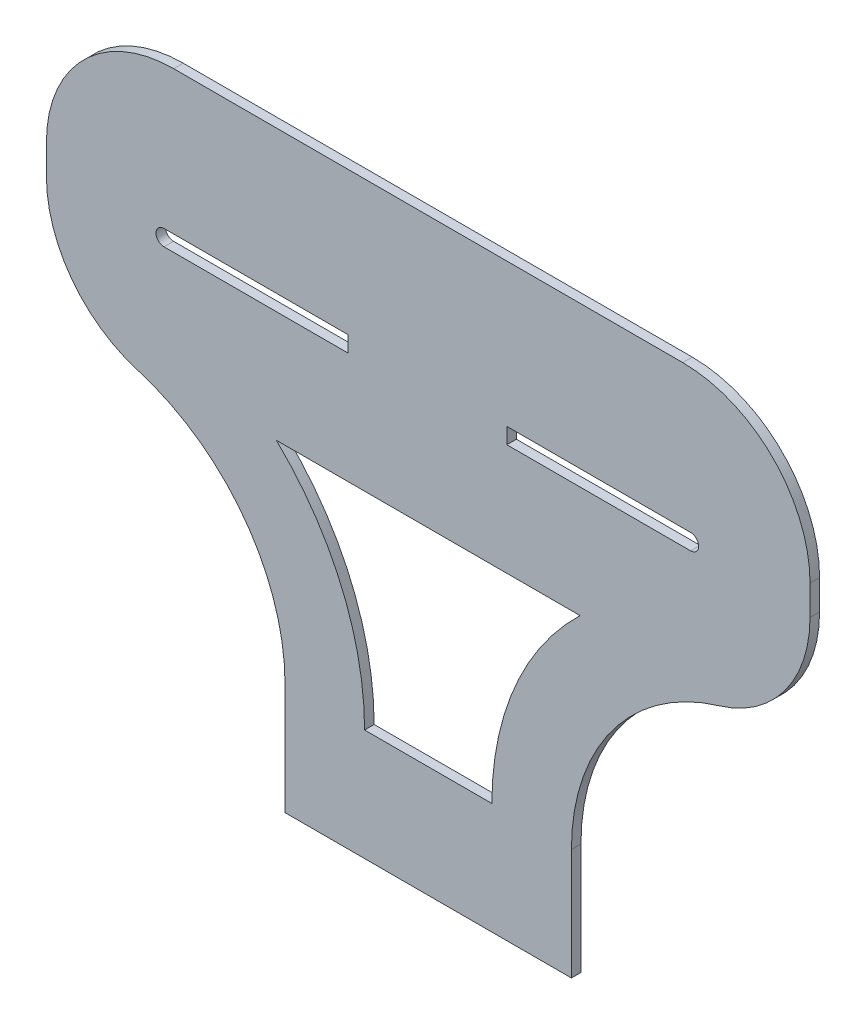
ISO-10303-21;
HEADER;
FILE_DESCRIPTION(('STEP AP214'),'2;1');
FILE_NAME('part.step','',(''),(''),'','','');
FILE_SCHEMA(('AUTOMOTIVE_DESIGN { 1 0 10303 214 1 1 1 1 }'));
ENDSEC;
DATA;
#1=APPLICATION_CONTEXT('core data for automotive mechanical design processes');
#2=APPLICATION_PROTOCOL_DEFINITION('international standard','automotive_design',2000,#1);
#3=PRODUCT_CONTEXT('',#1,'mechanical');
#4=PRODUCT('Part','Part','',(#3));
#5=PRODUCT_RELATED_PRODUCT_CATEGORY('part','',(#4));
#6=PRODUCT_DEFINITION_FORMATION('','',#4);
#7=PRODUCT_DEFINITION_CONTEXT('part definition',#1,'design');
#8=PRODUCT_DEFINITION('design','',#6,#7);
#9=PRODUCT_DEFINITION_SHAPE('','',#8);
#10=(LENGTH_UNIT() NAMED_UNIT(*) SI_UNIT(.MILLI.,.METRE.));
#11=(NAMED_UNIT(*) PLANE_ANGLE_UNIT() SI_UNIT($,.RADIAN.));
#12=(NAMED_UNIT(*) SI_UNIT($,.STERADIAN.) SOLID_ANGLE_UNIT());
#13=UNCERTAINTY_MEASURE_WITH_UNIT(LENGTH_MEASURE(1.E-05),#10,'distance_accuracy_value','');
#14=(GEOMETRIC_REPRESENTATION_CONTEXT(3) GLOBAL_UNCERTAINTY_ASSIGNED_CONTEXT((#13)) GLOBAL_UNIT_ASSIGNED_CONTEXT((#10,
#11,#12)) REPRESENTATION_CONTEXT('',''));
#15=CARTESIAN_POINT('',(0.,0.,0.));
#16=DIRECTION('',(0.,0.,1.));
#17=DIRECTION('',(1.,0.,0.));
#18=AXIS2_PLACEMENT_3D('',#15,#16,#17);
#19=CARTESIAN_POINT('',(254.97396933685,270.,0.));
#20=DIRECTION('',(0.,-1.,0.));
#21=DIRECTION('',(0.,0.,-1.));
#22=AXIS2_PLACEMENT_3D('',#19,#20,#21);
#23=PLANE('',#22);
#24=DIRECTION('',(0.,0.,1.));
#25=VECTOR('',#24,1.);
#26=CARTESIAN_POINT('',(139.426888361613,270.,0.));
#27=LINE('',#26,#25);
#28=CARTESIAN_POINT('',(139.426888361613,270.,0.));
#29=VERTEX_POINT('',#28);
#30=CARTESIAN_POINT('',(139.426888361613,270.,6.));
#31=VERTEX_POINT('',#30);
#32=EDGE_CURVE('E236',#29,#31,#27,.T.);
#33=ORIENTED_EDGE('',*,*,#32,.T.);
#34=DIRECTION('',(1.,0.,0.));
#35=VECTOR('',#34,1.);
#36=CARTESIAN_POINT('',(254.97396933685,270.,6.));
#37=LINE('',#36,#35);
#38=CARTESIAN_POINT('',(254.97396933685,270.,6.));
#39=VERTEX_POINT('',#38);
#40=EDGE_CURVE('E285',#31,#39,#37,.T.);
#41=ORIENTED_EDGE('',*,*,#40,.T.);
#42=DIRECTION('',(0.,0.,1.));
#43=VECTOR('',#42,1.);
#44=CARTESIAN_POINT('',(254.97396933685,270.,0.));
#45=LINE('',#44,#43);
#46=CARTESIAN_POINT('',(254.97396933685,270.,0.));
#47=VERTEX_POINT('',#46);
#48=EDGE_CURVE('E287',#47,#39,#45,.T.);
#49=ORIENTED_EDGE('',*,*,#48,.F.);
#50=DIRECTION('',(1.,0.,0.));
#51=VECTOR('',#50,1.);
#52=CARTESIAN_POINT('',(254.97396933685,270.,0.));
#53=LINE('',#52,#51);
#54=EDGE_CURVE('E52',#29,#47,#53,.T.);
#55=ORIENTED_EDGE('',*,*,#54,.F.);
#56=EDGE_LOOP('',(#33,#41,#49,#55));
#57=FACE_BOUND('',#56,.T.);
#58=ADVANCED_FACE('F37',(#57),#23,.F.);
#59=CARTESIAN_POINT('',(254.97396933685,280.,0.));
#60=DIRECTION('',(0.,1.,0.));
#61=DIRECTION('',(0.,0.,1.));
#62=AXIS2_PLACEMENT_3D('',#59,#60,#61);
#63=PLANE('',#62);
#64=DIRECTION('',(0.,0.,1.));
#65=VECTOR('',#64,1.);
#66=CARTESIAN_POINT('',(139.426888361613,280.,0.));
#67=LINE('',#66,#65);
#68=CARTESIAN_POINT('',(139.426888361613,280.,0.));
#69=VERTEX_POINT('',#68);
#70=CARTESIAN_POINT('',(139.426888361613,280.,6.));
#71=VERTEX_POINT('',#70);
#72=EDGE_CURVE('E232',#69,#71,#67,.T.);
#73=ORIENTED_EDGE('',*,*,#72,.F.);
#74=DIRECTION('',(-1.,0.,0.));
#75=VECTOR('',#74,1.);
#76=CARTESIAN_POINT('',(254.97396933685,280.,0.));
#77=LINE('',#76,#75);
#78=CARTESIAN_POINT('',(254.97396933685,280.,0.));
#79=VERTEX_POINT('',#78);
#80=EDGE_CURVE('E274',#79,#69,#77,.T.);
#81=ORIENTED_EDGE('',*,*,#80,.F.);
#82=DIRECTION('',(0.,0.,1.));
#83=VECTOR('',#82,1.);
#84=CARTESIAN_POINT('',(254.97396933685,280.,0.));
#85=LINE('',#84,#83);
#86=CARTESIAN_POINT('',(254.97396933685,280.,6.));
#87=VERTEX_POINT('',#86);
#88=EDGE_CURVE('E282',#79,#87,#85,.T.);
#89=ORIENTED_EDGE('',*,*,#88,.T.);
#90=DIRECTION('',(-1.,0.,0.));
#91=VECTOR('',#90,1.);
#92=CARTESIAN_POINT('',(254.97396933685,280.,6.));
#93=LINE('',#92,#91);
#94=EDGE_CURVE('E211',#87,#71,#93,.T.);
#95=ORIENTED_EDGE('',*,*,#94,.T.);
#96=EDGE_LOOP('',(#73,#81,#89,#95));
#97=FACE_BOUND('',#96,.T.);
#98=ADVANCED_FACE('F446',(#97),#63,.F.);
#99=CARTESIAN_POINT('',(-150.,0.,6.));
#100=DIRECTION('',(-1.,0.,0.));
#101=DIRECTION('',(0.,0.,1.));
#102=AXIS2_PLACEMENT_3D('',#99,#100,#101);
#103=PLANE('',#102);
#104=DIRECTION('',(0.,1.,0.));
#105=VECTOR('',#104,1.);
#106=CARTESIAN_POINT('',(-150.,0.,0.));
#107=LINE('',#106,#105);
#108=CARTESIAN_POINT('',(-150.,271.290245353056,0.));
#109=VERTEX_POINT('',#108);
#110=CARTESIAN_POINT('',(-150.,290.,0.));
#111=VERTEX_POINT('',#110);
#112=EDGE_CURVE('E304',#109,#111,#107,.T.);
#113=ORIENTED_EDGE('',*,*,#112,.F.);
#114=DIRECTION('',(0.,0.,-1.));
#115=VECTOR('',#114,1.);
#116=CARTESIAN_POINT('',(-150.,271.290245353056,6.));
#117=LINE('',#116,#115);
#118=CARTESIAN_POINT('',(-150.,271.290245353056,6.));
#119=VERTEX_POINT('',#118);
#120=EDGE_CURVE('E45',#109,#119,#117,.F.);
#121=ORIENTED_EDGE('',*,*,#120,.T.);
#122=DIRECTION('',(0.,1.,0.));
#123=VECTOR('',#122,1.);
#124=CARTESIAN_POINT('',(-150.,0.,6.));
#125=LINE('',#124,#123);
#126=CARTESIAN_POINT('',(-150.,290.,6.));
#127=VERTEX_POINT('',#126);
#128=EDGE_CURVE('E307',#119,#127,#125,.T.);
#129=ORIENTED_EDGE('',*,*,#128,.T.);
#130=DIRECTION('',(0.,0.,-1.));
#131=VECTOR('',#130,1.);
#132=CARTESIAN_POINT('',(-150.,290.,6.));
#133=LINE('',#132,#131);
#134=EDGE_CURVE('E365',#127,#111,#133,.T.);
#135=ORIENTED_EDGE('',*,*,#134,.T.);
#136=EDGE_LOOP('',(#113,#121,#129,#135));
#137=FACE_BOUND('',#136,.T.);
#138=ADVANCED_FACE('F385',(#137),#103,.T.);
#139=CARTESIAN_POINT('',(0.,0.,6.));
#140=DIRECTION('',(-1.,0.,0.));
#141=DIRECTION('',(0.,0.,1.));
#142=AXIS2_PLACEMENT_3D('',#139,#140,#141);
#143=PLANE('',#142);
#144=DIRECTION('',(0.,1.,0.));
#145=VECTOR('',#144,1.);
#146=CARTESIAN_POINT('',(0.,0.,0.));
#147=LINE('',#146,#145);
#148=CARTESIAN_POINT('',(0.,0.,0.));
#149=VERTEX_POINT('',#148);
#150=CARTESIAN_POINT('',(0.,70.0000000000001,0.));
#151=VERTEX_POINT('',#150);
#152=EDGE_CURVE('E326',#149,#151,#147,.T.);
#153=ORIENTED_EDGE('',*,*,#152,.F.);
#154=DIRECTION('',(0.,0.,-1.));
#155=VECTOR('',#154,1.);
#156=CARTESIAN_POINT('',(0.,0.,6.));
#157=LINE('',#156,#155);
#158=CARTESIAN_POINT('',(0.,0.,6.));
#159=VERTEX_POINT('',#158);
#160=EDGE_CURVE('E344',#159,#149,#157,.T.);
#161=ORIENTED_EDGE('',*,*,#160,.F.);
#162=DIRECTION('',(0.,1.,0.));
#163=VECTOR('',#162,1.);
#164=CARTESIAN_POINT('',(0.,0.,6.));
#165=LINE('',#164,#163);
#166=CARTESIAN_POINT('',(0.,70.0000000000001,6.));
#167=VERTEX_POINT('',#166);
#168=EDGE_CURVE('E309',#159,#167,#165,.T.);
#169=ORIENTED_EDGE('',*,*,#168,.T.);
#170=DIRECTION('',(0.,0.,-1.));
#171=VECTOR('',#170,1.);
#172=CARTESIAN_POINT('',(0.,70.0000000000001,6.));
#173=LINE('',#172,#171);
#174=EDGE_CURVE('E346',#167,#151,#173,.T.);
#175=ORIENTED_EDGE('',*,*,#174,.T.);
#176=EDGE_LOOP('',(#153,#161,#169,#175));
#177=FACE_BOUND('',#176,.T.);
#178=ADVANCED_FACE('F430',(#177),#143,.T.);
#179=CARTESIAN_POINT('',(0.,0.,6.));
#180=DIRECTION('',(0.,1.,0.));
#181=DIRECTION('',(0.,0.,1.));
#182=AXIS2_PLACEMENT_3D('',#179,#180,#181);
#183=PLANE('',#182);
#184=DIRECTION('',(1.,0.,0.));
#185=VECTOR('',#184,1.);
#186=CARTESIAN_POINT('',(0.,0.,0.));
#187=LINE('',#186,#185);
#188=CARTESIAN_POINT('',(180.,0.,0.));
#189=VERTEX_POINT('',#188);
#190=EDGE_CURVE('E329',#149,#189,#187,.T.);
#191=ORIENTED_EDGE('',*,*,#190,.T.);
#192=DIRECTION('',(0.,0.,-1.));
#193=VECTOR('',#192,1.);
#194=CARTESIAN_POINT('',(180.,0.,6.));
#195=LINE('',#194,#193);
#196=CARTESIAN_POINT('',(180.,0.,6.));
#197=VERTEX_POINT('',#196);
#198=EDGE_CURVE('E341',#197,#189,#195,.T.);
#199=ORIENTED_EDGE('',*,*,#198,.F.);
#200=DIRECTION('',(1.,0.,0.));
#201=VECTOR('',#200,1.);
#202=CARTESIAN_POINT('',(0.,0.,6.));
#203=LINE('',#202,#201);
#204=EDGE_CURVE('E313',#159,#197,#203,.T.);
#205=ORIENTED_EDGE('',*,*,#204,.F.);
#206=ORIENTED_EDGE('',*,*,#160,.T.);
#207=EDGE_LOOP('',(#191,#199,#205,#206));
#208=FACE_BOUND('',#207,.T.);
#209=ADVANCED_FACE('F436',(#208),#183,.F.);
#210=CARTESIAN_POINT('',(180.,0.,6.));
#211=DIRECTION('',(-1.,0.,0.));
#212=DIRECTION('',(0.,0.,1.));
#213=AXIS2_PLACEMENT_3D('',#210,#211,#212);
#214=PLANE('',#213);
#215=DIRECTION('',(0.,1.,0.));
#216=VECTOR('',#215,1.);
#217=CARTESIAN_POINT('',(180.,0.,0.));
#218=LINE('',#217,#216);
#219=CARTESIAN_POINT('',(180.,70.,0.));
#220=VERTEX_POINT('',#219);
#221=EDGE_CURVE('E331',#189,#220,#218,.T.);
#222=ORIENTED_EDGE('',*,*,#221,.T.);
#223=DIRECTION('',(0.,0.,-1.));
#224=VECTOR('',#223,1.);
#225=CARTESIAN_POINT('',(180.,70.,6.));
#226=LINE('',#225,#224);
#227=CARTESIAN_POINT('',(180.,70.,6.));
#228=VERTEX_POINT('',#227);
#229=EDGE_CURVE('E324',#228,#220,#226,.T.);
#230=ORIENTED_EDGE('',*,*,#229,.F.);
#231=DIRECTION('',(0.,1.,0.));
#232=VECTOR('',#231,1.);
#233=CARTESIAN_POINT('',(180.,0.,6.));
#234=LINE('',#233,#232);
#235=EDGE_CURVE('E315',#197,#228,#234,.T.);
#236=ORIENTED_EDGE('',*,*,#235,.F.);
#237=ORIENTED_EDGE('',*,*,#198,.T.);
#238=EDGE_LOOP('',(#222,#230,#236,#237));
#239=FACE_BOUND('',#238,.T.);
#240=ADVANCED_FACE('F424',(#239),#214,.F.);
#241=CARTESIAN_POINT('',(330.,2.15513881250766E-13,6.));
#242=DIRECTION('',(1.,0.,0.));
#243=DIRECTION('',(0.,1.,0.));
#244=AXIS2_PLACEMENT_3D('',#241,#242,#243);
#245=PLANE('',#244);
#246=DIRECTION('',(0.,-1.,0.));
#247=VECTOR('',#246,1.);
#248=CARTESIAN_POINT('',(330.,2.15513881250766E-13,6.));
#249=LINE('',#248,#247);
#250=CARTESIAN_POINT('',(330.,290.,6.));
#251=VERTEX_POINT('',#250);
#252=CARTESIAN_POINT('',(330.,271.290245353056,6.));
#253=VERTEX_POINT('',#252);
#254=EDGE_CURVE('E318',#251,#253,#249,.T.);
#255=ORIENTED_EDGE('',*,*,#254,.T.);
#256=DIRECTION('',(0.,0.,-1.));
#257=VECTOR('',#256,1.);
#258=CARTESIAN_POINT('',(330.,271.290245353056,0.));
#259=LINE('',#258,#257);
#260=CARTESIAN_POINT('',(330.,271.290245353056,0.));
#261=VERTEX_POINT('',#260);
#262=EDGE_CURVE('E375',#253,#261,#259,.T.);
#263=ORIENTED_EDGE('',*,*,#262,.T.);
#264=DIRECTION('',(0.,-1.,0.));
#265=VECTOR('',#264,1.);
#266=CARTESIAN_POINT('',(330.,2.15513881250766E-13,0.));
#267=LINE('',#266,#265);
#268=CARTESIAN_POINT('',(330.,290.,0.));
#269=VERTEX_POINT('',#268);
#270=EDGE_CURVE('E334',#269,#261,#267,.T.);
#271=ORIENTED_EDGE('',*,*,#270,.F.);
#272=DIRECTION('',(0.,0.,-1.));
#273=VECTOR('',#272,1.);
#274=CARTESIAN_POINT('',(330.,290.,6.));
#275=LINE('',#274,#273);
#276=EDGE_CURVE('E358',#269,#251,#275,.F.);
#277=ORIENTED_EDGE('',*,*,#276,.T.);
#278=EDGE_LOOP('',(#255,#263,#271,#277));
#279=FACE_BOUND('',#278,.T.);
#280=ADVANCED_FACE('F411',(#279),#245,.T.);
#281=CARTESIAN_POINT('',(0.,370.,6.));
#282=DIRECTION('',(0.,1.,0.));
#283=DIRECTION('',(0.,0.,1.));
#284=AXIS2_PLACEMENT_3D('',#281,#282,#283);
#285=PLANE('',#284);
#286=DIRECTION('',(1.,0.,0.));
#287=VECTOR('',#286,1.);
#288=CARTESIAN_POINT('',(0.,370.,6.));
#289=LINE('',#288,#287);
#290=CARTESIAN_POINT('',(-70.,370.,6.));
#291=VERTEX_POINT('',#290);
#292=CARTESIAN_POINT('',(250.,370.,6.));
#293=VERTEX_POINT('',#292);
#294=EDGE_CURVE('E321',#291,#293,#289,.T.);
#295=ORIENTED_EDGE('',*,*,#294,.T.);
#296=DIRECTION('',(0.,0.,-1.));
#297=VECTOR('',#296,1.);
#298=CARTESIAN_POINT('',(250.,370.,6.));
#299=LINE('',#298,#297);
#300=CARTESIAN_POINT('',(250.,370.,0.));
#301=VERTEX_POINT('',#300);
#302=EDGE_CURVE('E351',#293,#301,#299,.T.);
#303=ORIENTED_EDGE('',*,*,#302,.T.);
#304=DIRECTION('',(1.,0.,0.));
#305=VECTOR('',#304,1.);
#306=CARTESIAN_POINT('',(0.,370.,0.));
#307=LINE('',#306,#305);
#308=CARTESIAN_POINT('',(-70.,370.,0.));
#309=VERTEX_POINT('',#308);
#310=EDGE_CURVE('E310',#309,#301,#307,.T.);
#311=ORIENTED_EDGE('',*,*,#310,.F.);
#312=DIRECTION('',(0.,0.,-1.));
#313=VECTOR('',#312,1.);
#314=CARTESIAN_POINT('',(-70.,370.,6.));
#315=LINE('',#314,#313);
#316=EDGE_CURVE('E349',#309,#291,#315,.F.);
#317=ORIENTED_EDGE('',*,*,#316,.T.);
#318=EDGE_LOOP('',(#295,#303,#311,#317));
#319=FACE_BOUND('',#318,.T.);
#320=ADVANCED_FACE('F402',(#319),#285,.T.);
#321=CARTESIAN_POINT('',(0.,0.,6.));
#322=DIRECTION('',(0.,0.,1.));
#323=DIRECTION('',(1.,0.,0.));
#324=AXIS2_PLACEMENT_3D('',#321,#322,#323);
#325=PLANE('',#324);
#326=DIRECTION('',(0.,-1.,0.));
#327=VECTOR('',#326,1.);
#328=CARTESIAN_POINT('',(39.4268883616133,280.,6.));
#329=LINE('',#328,#327);
#330=CARTESIAN_POINT('',(39.4268883616133,280.,6.));
#331=VERTEX_POINT('',#330);
#332=CARTESIAN_POINT('',(39.4268883616133,270.,6.));
#333=VERTEX_POINT('',#332);
#334=EDGE_CURVE('E205',#331,#333,#329,.T.);
#335=ORIENTED_EDGE('',*,*,#334,.T.);
#336=CARTESIAN_POINT('',(-76.1201926136232,270.,6.));
#337=VERTEX_POINT('',#336);
#338=EDGE_CURVE('E273',#337,#333,#37,.T.);
#339=ORIENTED_EDGE('',*,*,#338,.F.);
#340=CARTESIAN_POINT('',(-76.1201926136232,275.,6.));
#341=DIRECTION('',(0.,0.,1.));
#342=DIRECTION('',(1.,0.,0.));
#343=AXIS2_PLACEMENT_3D('',#340,#341,#342);
#344=CIRCLE('',#343,5.);
#345=CARTESIAN_POINT('',(-76.1201926136232,280.,6.));
#346=VERTEX_POINT('',#345);
#347=EDGE_CURVE('E207',#346,#337,#344,.T.);
#348=ORIENTED_EDGE('',*,*,#347,.F.);
#349=EDGE_CURVE('E199',#331,#346,#93,.T.);
#350=ORIENTED_EDGE('',*,*,#349,.F.);
#351=EDGE_LOOP('',(#335,#339,#348,#350));
#352=FACE_BOUND('',#351,.T.);
#353=CARTESIAN_POINT('',(-130.059209580978,70.0000000000001,6.));
#354=DIRECTION('',(0.,0.,-1.));
#355=DIRECTION('',(1.,0.,0.));
#356=AXIS2_PLACEMENT_3D('',#353,#354,#355);
#357=CIRCLE('',#356,180.059209580978);
#358=CARTESIAN_POINT('',(-5.47462403795615,200.,6.));
#359=VERTEX_POINT('',#358);
#360=CARTESIAN_POINT('',(50.,70.0000000000001,6.));
#361=VERTEX_POINT('',#360);
#362=EDGE_CURVE('E235',#359,#361,#357,.T.);
#363=ORIENTED_EDGE('',*,*,#362,.F.);
#364=DIRECTION('',(-1.,0.,0.));
#365=VECTOR('',#364,1.);
#366=CARTESIAN_POINT('',(-5.47462403795615,200.,6.));
#367=LINE('',#366,#365);
#368=CARTESIAN_POINT('',(185.453428356756,200.,6.));
#369=VERTEX_POINT('',#368);
#370=EDGE_CURVE('E243',#369,#359,#367,.T.);
#371=ORIENTED_EDGE('',*,*,#370,.F.);
#372=CARTESIAN_POINT('',(310.059209580978,70.0203160473616,6.));
#373=DIRECTION('',(0.,0.,-1.));
#374=DIRECTION('',(1.,0.,0.));
#375=AXIS2_PLACEMENT_3D('',#372,#373,#374);
#376=CIRCLE('',#375,180.059209580978);
#377=CARTESIAN_POINT('',(130.,70.0203160473617,6.));
#378=VERTEX_POINT('',#377);
#379=EDGE_CURVE('E257',#378,#369,#376,.T.);
#380=ORIENTED_EDGE('',*,*,#379,.F.);
#381=DIRECTION('',(0.99999996775455,0.000253950583831164,0.));
#382=VECTOR('',#381,1.);
#383=CARTESIAN_POINT('',(50.,70.0000000000001,6.));
#384=LINE('',#383,#382);
#385=EDGE_CURVE('E254',#361,#378,#384,.T.);
#386=ORIENTED_EDGE('',*,*,#385,.F.);
#387=EDGE_LOOP('',(#363,#371,#380,#386));
#388=FACE_BOUND('',#387,.T.);
#389=CARTESIAN_POINT('',(254.97396933685,275.,6.));
#390=DIRECTION('',(0.,0.,1.));
#391=DIRECTION('',(1.,0.,0.));
#392=AXIS2_PLACEMENT_3D('',#389,#390,#391);
#393=CIRCLE('',#392,5.);
#394=EDGE_CURVE('E212',#39,#87,#393,.T.);
#395=ORIENTED_EDGE('',*,*,#394,.F.);
#396=ORIENTED_EDGE('',*,*,#40,.F.);
#397=DIRECTION('',(0.,-1.,0.));
#398=VECTOR('',#397,1.);
#399=CARTESIAN_POINT('',(139.426888361613,280.,6.));
#400=LINE('',#399,#398);
#401=EDGE_CURVE('E224',#71,#31,#400,.T.);
#402=ORIENTED_EDGE('',*,*,#401,.F.);
#403=ORIENTED_EDGE('',*,*,#94,.F.);
#404=EDGE_LOOP('',(#395,#396,#402,#403));
#405=FACE_BOUND('',#404,.T.);
#406=CARTESIAN_POINT('',(310.059209580978,70.,6.));
#407=DIRECTION('',(0.,0.,1.));
#408=DIRECTION('',(-1.,0.,0.));
#409=AXIS2_PLACEMENT_3D('',#406,#407,#408);
#410=CIRCLE('',#409,130.059209580978);
#411=CARTESIAN_POINT('',(272.8732497664,194.629861548095,6.));
#412=VERTEX_POINT('',#411);
#413=EDGE_CURVE('E290',#412,#228,#410,.T.);
#414=ORIENTED_EDGE('',*,*,#413,.F.);
#415=CARTESIAN_POINT('',(250.,271.290245353056,6.));
#416=DIRECTION('',(0.,0.,1.));
#417=DIRECTION('',(1.,0.,0.));
#418=AXIS2_PLACEMENT_3D('',#415,#416,#417);
#419=CIRCLE('',#418,80.);
#420=EDGE_CURVE('E373',#412,#253,#419,.T.);
#421=ORIENTED_EDGE('',*,*,#420,.T.);
#422=ORIENTED_EDGE('',*,*,#254,.F.);
#423=CARTESIAN_POINT('',(250.,290.,6.));
#424=DIRECTION('',(0.,0.,1.));
#425=DIRECTION('',(1.,0.,0.));
#426=AXIS2_PLACEMENT_3D('',#423,#424,#425);
#427=CIRCLE('',#426,80.);
#428=EDGE_CURVE('E363',#251,#293,#427,.T.);
#429=ORIENTED_EDGE('',*,*,#428,.T.);
#430=ORIENTED_EDGE('',*,*,#294,.F.);
#431=CARTESIAN_POINT('',(-70.,290.,6.));
#432=DIRECTION('',(0.,0.,1.));
#433=DIRECTION('',(1.,0.,0.));
#434=AXIS2_PLACEMENT_3D('',#431,#432,#433);
#435=CIRCLE('',#434,80.);
#436=EDGE_CURVE('E360',#291,#127,#435,.T.);
#437=ORIENTED_EDGE('',*,*,#436,.T.);
#438=ORIENTED_EDGE('',*,*,#128,.F.);
#439=CARTESIAN_POINT('',(-70.,271.290245353056,6.));
#440=DIRECTION('',(0.,0.,1.));
#441=DIRECTION('',(1.,0.,0.));
#442=AXIS2_PLACEMENT_3D('',#439,#440,#441);
#443=CIRCLE('',#442,80.);
#444=CARTESIAN_POINT('',(-92.8732497663998,194.629861548095,6.));
#445=VERTEX_POINT('',#444);
#446=EDGE_CURVE('E371',#119,#445,#443,.T.);
#447=ORIENTED_EDGE('',*,*,#446,.T.);
#448=CARTESIAN_POINT('',(-130.059209580978,70.0000000000001,6.));
#449=DIRECTION('',(0.,0.,1.));
#450=DIRECTION('',(1.,0.,0.));
#451=AXIS2_PLACEMENT_3D('',#448,#449,#450);
#452=CIRCLE('',#451,130.059209580978);
#453=EDGE_CURVE('E299',#167,#445,#452,.T.);
#454=ORIENTED_EDGE('',*,*,#453,.F.);
#455=ORIENTED_EDGE('',*,*,#168,.F.);
#456=ORIENTED_EDGE('',*,*,#204,.T.);
#457=ORIENTED_EDGE('',*,*,#235,.T.);
#458=EDGE_LOOP('',(#414,#421,#422,#429,#430,#437,#438,#447,#454,#455,#456,#457));
#459=FACE_BOUND('',#458,.T.);
#460=ADVANCED_FACE('F201',(#352,#388,#405,#459),#325,.T.);
#461=CARTESIAN_POINT('',(0.,0.,0.));
#462=DIRECTION('',(0.,0.,1.));
#463=DIRECTION('',(1.,0.,0.));
#464=AXIS2_PLACEMENT_3D('',#461,#462,#463);
#465=PLANE('',#464);
#466=CARTESIAN_POINT('',(-76.1201926136232,270.,0.));
#467=VERTEX_POINT('',#466);
#468=CARTESIAN_POINT('',(39.4268883616133,270.,0.));
#469=VERTEX_POINT('',#468);
#470=EDGE_CURVE('E280',#467,#469,#53,.T.);
#471=ORIENTED_EDGE('',*,*,#470,.T.);
#472=DIRECTION('',(0.,-1.,0.));
#473=VECTOR('',#472,1.);
#474=CARTESIAN_POINT('',(39.4268883616133,280.,0.));
#475=LINE('',#474,#473);
#476=CARTESIAN_POINT('',(39.4268883616133,280.,0.));
#477=VERTEX_POINT('',#476);
#478=EDGE_CURVE('E227',#477,#469,#475,.T.);
#479=ORIENTED_EDGE('',*,*,#478,.F.);
#480=CARTESIAN_POINT('',(-76.1201926136232,280.,0.));
#481=VERTEX_POINT('',#480);
#482=EDGE_CURVE('E217',#477,#481,#77,.T.);
#483=ORIENTED_EDGE('',*,*,#482,.T.);
#484=CARTESIAN_POINT('',(-76.1201926136232,275.,0.));
#485=DIRECTION('',(0.,0.,1.));
#486=DIRECTION('',(1.,0.,0.));
#487=AXIS2_PLACEMENT_3D('',#484,#485,#486);
#488=CIRCLE('',#487,5.);
#489=EDGE_CURVE('E277',#481,#467,#488,.T.);
#490=ORIENTED_EDGE('',*,*,#489,.T.);
#491=EDGE_LOOP('',(#471,#479,#483,#490));
#492=FACE_BOUND('',#491,.T.);
#493=DIRECTION('',(-1.,0.,0.));
#494=VECTOR('',#493,1.);
#495=CARTESIAN_POINT('',(-5.47462403795615,200.,0.));
#496=LINE('',#495,#494);
#497=CARTESIAN_POINT('',(185.453428356756,200.,0.));
#498=VERTEX_POINT('',#497);
#499=CARTESIAN_POINT('',(-5.47462403795615,200.,0.));
#500=VERTEX_POINT('',#499);
#501=EDGE_CURVE('E249',#498,#500,#496,.T.);
#502=ORIENTED_EDGE('',*,*,#501,.T.);
#503=CARTESIAN_POINT('',(-130.059209580978,70.0000000000001,0.));
#504=DIRECTION('',(0.,0.,-1.));
#505=DIRECTION('',(1.,0.,0.));
#506=AXIS2_PLACEMENT_3D('',#503,#504,#505);
#507=CIRCLE('',#506,180.059209580978);
#508=CARTESIAN_POINT('',(50.,70.0000000000001,0.));
#509=VERTEX_POINT('',#508);
#510=EDGE_CURVE('E239',#500,#509,#507,.T.);
#511=ORIENTED_EDGE('',*,*,#510,.T.);
#512=DIRECTION('',(0.99999996775455,0.000253950583831164,0.));
#513=VECTOR('',#512,1.);
#514=CARTESIAN_POINT('',(50.,70.0000000000001,0.));
#515=LINE('',#514,#513);
#516=CARTESIAN_POINT('',(130.,70.0203160473617,0.));
#517=VERTEX_POINT('',#516);
#518=EDGE_CURVE('E242',#509,#517,#515,.T.);
#519=ORIENTED_EDGE('',*,*,#518,.T.);
#520=CARTESIAN_POINT('',(310.059209580978,70.0203160473616,0.));
#521=DIRECTION('',(0.,0.,-1.));
#522=DIRECTION('',(1.,0.,0.));
#523=AXIS2_PLACEMENT_3D('',#520,#521,#522);
#524=CIRCLE('',#523,180.059209580978);
#525=EDGE_CURVE('E246',#517,#498,#524,.T.);
#526=ORIENTED_EDGE('',*,*,#525,.T.);
#527=EDGE_LOOP('',(#502,#511,#519,#526));
#528=FACE_BOUND('',#527,.T.);
#529=DIRECTION('',(0.,-1.,0.));
#530=VECTOR('',#529,1.);
#531=CARTESIAN_POINT('',(139.426888361613,280.,0.));
#532=LINE('',#531,#530);
#533=EDGE_CURVE('E221',#69,#29,#532,.T.);
#534=ORIENTED_EDGE('',*,*,#533,.T.);
#535=ORIENTED_EDGE('',*,*,#54,.T.);
#536=CARTESIAN_POINT('',(254.97396933685,275.,0.));
#537=DIRECTION('',(0.,0.,1.));
#538=DIRECTION('',(1.,0.,0.));
#539=AXIS2_PLACEMENT_3D('',#536,#537,#538);
#540=CIRCLE('',#539,5.);
#541=EDGE_CURVE('E270',#47,#79,#540,.T.);
#542=ORIENTED_EDGE('',*,*,#541,.T.);
#543=ORIENTED_EDGE('',*,*,#80,.T.);
#544=EDGE_LOOP('',(#534,#535,#542,#543));
#545=FACE_BOUND('',#544,.T.);
#546=ORIENTED_EDGE('',*,*,#270,.T.);
#547=CARTESIAN_POINT('',(250.,271.290245353056,0.));
#548=DIRECTION('',(0.,0.,1.));
#549=DIRECTION('',(1.,0.,0.));
#550=AXIS2_PLACEMENT_3D('',#547,#548,#549);
#551=CIRCLE('',#550,80.);
#552=CARTESIAN_POINT('',(272.8732497664,194.629861548095,0.));
#553=VERTEX_POINT('',#552);
#554=EDGE_CURVE('E379',#261,#553,#551,.F.);
#555=ORIENTED_EDGE('',*,*,#554,.T.);
#556=CARTESIAN_POINT('',(310.059209580978,70.,0.));
#557=DIRECTION('',(0.,0.,1.));
#558=DIRECTION('',(-1.,0.,0.));
#559=AXIS2_PLACEMENT_3D('',#556,#557,#558);
#560=CIRCLE('',#559,130.059209580978);
#561=EDGE_CURVE('E297',#553,#220,#560,.T.);
#562=ORIENTED_EDGE('',*,*,#561,.T.);
#563=ORIENTED_EDGE('',*,*,#221,.F.);
#564=ORIENTED_EDGE('',*,*,#190,.F.);
#565=ORIENTED_EDGE('',*,*,#152,.T.);
#566=CARTESIAN_POINT('',(-130.059209580978,70.0000000000001,0.));
#567=DIRECTION('',(0.,0.,1.));
#568=DIRECTION('',(1.,0.,0.));
#569=AXIS2_PLACEMENT_3D('',#566,#567,#568);
#570=CIRCLE('',#569,130.059209580978);
#571=CARTESIAN_POINT('',(-92.8732497663998,194.629861548095,0.));
#572=VERTEX_POINT('',#571);
#573=EDGE_CURVE('E301',#151,#572,#570,.T.);
#574=ORIENTED_EDGE('',*,*,#573,.T.);
#575=CARTESIAN_POINT('',(-70.,271.290245353056,0.));
#576=DIRECTION('',(0.,0.,1.));
#577=DIRECTION('',(1.,0.,0.));
#578=AXIS2_PLACEMENT_3D('',#575,#576,#577);
#579=CIRCLE('',#578,80.);
#580=EDGE_CURVE('E377',#572,#109,#579,.F.);
#581=ORIENTED_EDGE('',*,*,#580,.T.);
#582=ORIENTED_EDGE('',*,*,#112,.T.);
#583=CARTESIAN_POINT('',(-70.,290.,0.));
#584=DIRECTION('',(0.,0.,1.));
#585=DIRECTION('',(1.,0.,0.));
#586=AXIS2_PLACEMENT_3D('',#583,#584,#585);
#587=CIRCLE('',#586,80.);
#588=EDGE_CURVE('E354',#111,#309,#587,.F.);
#589=ORIENTED_EDGE('',*,*,#588,.T.);
#590=ORIENTED_EDGE('',*,*,#310,.T.);
#591=CARTESIAN_POINT('',(250.,290.,0.));
#592=DIRECTION('',(0.,0.,1.));
#593=DIRECTION('',(1.,0.,0.));
#594=AXIS2_PLACEMENT_3D('',#591,#592,#593);
#595=CIRCLE('',#594,80.);
#596=EDGE_CURVE('E356',#301,#269,#595,.F.);
#597=ORIENTED_EDGE('',*,*,#596,.T.);
#598=EDGE_LOOP('',(#546,#555,#562,#563,#564,#565,#574,#581,#582,#589,#590,#597));
#599=FACE_BOUND('',#598,.T.);
#600=ADVANCED_FACE('F400',(#492,#528,#545,#599),#465,.F.);
#601=CARTESIAN_POINT('',(250.,290.,6.));
#602=DIRECTION('',(0.,0.,-1.));
#603=DIRECTION('',(-1.,0.,0.));
#604=AXIS2_PLACEMENT_3D('',#601,#602,#603);
#605=CYLINDRICAL_SURFACE('',#604,80.);
#606=ORIENTED_EDGE('',*,*,#428,.F.);
#607=ORIENTED_EDGE('',*,*,#276,.F.);
#608=ORIENTED_EDGE('',*,*,#596,.F.);
#609=ORIENTED_EDGE('',*,*,#302,.F.);
#610=EDGE_LOOP('',(#606,#607,#608,#609));
#611=FACE_BOUND('',#610,.T.);
#612=ADVANCED_FACE('F406',(#611),#605,.T.);
#613=CARTESIAN_POINT('',(-70.,290.,6.));
#614=DIRECTION('',(0.,0.,-1.));
#615=DIRECTION('',(-1.,0.,0.));
#616=AXIS2_PLACEMENT_3D('',#613,#614,#615);
#617=CYLINDRICAL_SURFACE('',#616,80.);
#618=ORIENTED_EDGE('',*,*,#436,.F.);
#619=ORIENTED_EDGE('',*,*,#316,.F.);
#620=ORIENTED_EDGE('',*,*,#588,.F.);
#621=ORIENTED_EDGE('',*,*,#134,.F.);
#622=EDGE_LOOP('',(#618,#619,#620,#621));
#623=FACE_BOUND('',#622,.T.);
#624=ADVANCED_FACE('F397',(#623),#617,.T.);
#625=CARTESIAN_POINT('',(-130.059209580978,70.0000000000001,0.));
#626=DIRECTION('',(0.,0.,1.));
#627=DIRECTION('',(1.,0.,0.));
#628=AXIS2_PLACEMENT_3D('',#625,#626,#627);
#629=CYLINDRICAL_SURFACE('',#628,130.059209580978);
#630=ORIENTED_EDGE('',*,*,#453,.T.);
#631=DIRECTION('',(0.,0.,1.));
#632=VECTOR('',#631,1.);
#633=CARTESIAN_POINT('',(-92.8732497663998,194.629861548095,0.));
#634=LINE('',#633,#632);
#635=EDGE_CURVE('E11',#445,#572,#634,.F.);
#636=ORIENTED_EDGE('',*,*,#635,.T.);
#637=ORIENTED_EDGE('',*,*,#573,.F.);
#638=ORIENTED_EDGE('',*,*,#174,.F.);
#639=EDGE_LOOP('',(#630,#636,#637,#638));
#640=FACE_BOUND('',#639,.T.);
#641=ADVANCED_FACE('F434',(#640),#629,.F.);
#642=CARTESIAN_POINT('',(310.059209580978,70.,0.));
#643=DIRECTION('',(0.,0.,1.));
#644=DIRECTION('',(1.,0.,0.));
#645=AXIS2_PLACEMENT_3D('',#642,#643,#644);
#646=CYLINDRICAL_SURFACE('',#645,130.059209580978);
#647=ORIENTED_EDGE('',*,*,#561,.F.);
#648=DIRECTION('',(0.,0.,1.));
#649=VECTOR('',#648,1.);
#650=CARTESIAN_POINT('',(272.8732497664,194.629861548095,0.));
#651=LINE('',#650,#649);
#652=EDGE_CURVE('E368',#553,#412,#651,.T.);
#653=ORIENTED_EDGE('',*,*,#652,.T.);
#654=ORIENTED_EDGE('',*,*,#413,.T.);
#655=ORIENTED_EDGE('',*,*,#229,.T.);
#656=EDGE_LOOP('',(#647,#653,#654,#655));
#657=FACE_BOUND('',#656,.T.);
#658=ADVANCED_FACE('F420',(#657),#646,.F.);
#659=CARTESIAN_POINT('',(250.,271.290245353056,0.));
#660=DIRECTION('',(0.,0.,1.));
#661=DIRECTION('',(1.,0.,0.));
#662=AXIS2_PLACEMENT_3D('',#659,#660,#661);
#663=CYLINDRICAL_SURFACE('',#662,80.);
#664=ORIENTED_EDGE('',*,*,#554,.F.);
#665=ORIENTED_EDGE('',*,*,#262,.F.);
#666=ORIENTED_EDGE('',*,*,#420,.F.);
#667=ORIENTED_EDGE('',*,*,#652,.F.);
#668=EDGE_LOOP('',(#664,#665,#666,#667));
#669=FACE_BOUND('',#668,.T.);
#670=ADVANCED_FACE('F415',(#669),#663,.T.);
#671=CARTESIAN_POINT('',(-70.,271.290245353056,0.));
#672=DIRECTION('',(0.,0.,1.));
#673=DIRECTION('',(1.,0.,0.));
#674=AXIS2_PLACEMENT_3D('',#671,#672,#673);
#675=CYLINDRICAL_SURFACE('',#674,80.);
#676=ORIENTED_EDGE('',*,*,#580,.F.);
#677=ORIENTED_EDGE('',*,*,#635,.F.);
#678=ORIENTED_EDGE('',*,*,#446,.F.);
#679=ORIENTED_EDGE('',*,*,#120,.F.);
#680=EDGE_LOOP('',(#676,#677,#678,#679));
#681=FACE_BOUND('',#680,.T.);
#682=ADVANCED_FACE('F39',(#681),#675,.T.);
#683=CARTESIAN_POINT('',(254.97396933685,275.,0.));
#684=DIRECTION('',(0.,0.,1.));
#685=DIRECTION('',(1.,0.,0.));
#686=AXIS2_PLACEMENT_3D('',#683,#684,#685);
#687=CYLINDRICAL_SURFACE('',#686,5.);
#688=ORIENTED_EDGE('',*,*,#394,.T.);
#689=ORIENTED_EDGE('',*,*,#88,.F.);
#690=ORIENTED_EDGE('',*,*,#541,.F.);
#691=ORIENTED_EDGE('',*,*,#48,.T.);
#692=EDGE_LOOP('',(#688,#689,#690,#691));
#693=FACE_BOUND('',#692,.T.);
#694=ADVANCED_FACE('F458',(#693),#687,.F.);
#695=ORIENTED_EDGE('',*,*,#338,.T.);
#696=DIRECTION('',(0.,0.,1.));
#697=VECTOR('',#696,1.);
#698=CARTESIAN_POINT('',(39.4268883616133,270.,0.));
#699=LINE('',#698,#697);
#700=EDGE_CURVE('E60',#469,#333,#699,.T.);
#701=ORIENTED_EDGE('',*,*,#700,.F.);
#702=ORIENTED_EDGE('',*,*,#470,.F.);
#703=DIRECTION('',(0.,0.,1.));
#704=VECTOR('',#703,1.);
#705=CARTESIAN_POINT('',(-76.1201926136232,270.,0.));
#706=LINE('',#705,#704);
#707=EDGE_CURVE('E291',#467,#337,#706,.T.);
#708=ORIENTED_EDGE('',*,*,#707,.T.);
#709=EDGE_LOOP('',(#695,#701,#702,#708));
#710=FACE_BOUND('',#709,.T.);
#711=ADVANCED_FACE('F448',(#710),#23,.F.);
#712=CARTESIAN_POINT('',(-76.1201926136232,275.,0.));
#713=DIRECTION('',(0.,0.,1.));
#714=DIRECTION('',(1.,0.,0.));
#715=AXIS2_PLACEMENT_3D('',#712,#713,#714);
#716=CYLINDRICAL_SURFACE('',#715,5.);
#717=ORIENTED_EDGE('',*,*,#347,.T.);
#718=ORIENTED_EDGE('',*,*,#707,.F.);
#719=ORIENTED_EDGE('',*,*,#489,.F.);
#720=DIRECTION('',(0.,0.,1.));
#721=VECTOR('',#720,1.);
#722=CARTESIAN_POINT('',(-76.1201926136232,280.,0.));
#723=LINE('',#722,#721);
#724=EDGE_CURVE('E293',#481,#346,#723,.T.);
#725=ORIENTED_EDGE('',*,*,#724,.T.);
#726=EDGE_LOOP('',(#717,#718,#719,#725));
#727=FACE_BOUND('',#726,.T.);
#728=ADVANCED_FACE('F457',(#727),#716,.F.);
#729=ORIENTED_EDGE('',*,*,#482,.F.);
#730=DIRECTION('',(0.,0.,1.));
#731=VECTOR('',#730,1.);
#732=CARTESIAN_POINT('',(39.4268883616133,280.,0.));
#733=LINE('',#732,#731);
#734=EDGE_CURVE('E215',#477,#331,#733,.T.);
#735=ORIENTED_EDGE('',*,*,#734,.T.);
#736=ORIENTED_EDGE('',*,*,#349,.T.);
#737=ORIENTED_EDGE('',*,*,#724,.F.);
#738=EDGE_LOOP('',(#729,#735,#736,#737));
#739=FACE_BOUND('',#738,.T.);
#740=ADVANCED_FACE('F216',(#739),#63,.F.);
#741=CARTESIAN_POINT('',(-130.059209580978,70.0000000000001,0.));
#742=DIRECTION('',(0.,0.,1.));
#743=DIRECTION('',(1.,0.,0.));
#744=AXIS2_PLACEMENT_3D('',#741,#742,#743);
#745=CYLINDRICAL_SURFACE('',#744,180.059209580978);
#746=ORIENTED_EDGE('',*,*,#362,.T.);
#747=DIRECTION('',(0.,0.,1.));
#748=VECTOR('',#747,1.);
#749=CARTESIAN_POINT('',(50.,70.0000000000001,0.));
#750=LINE('',#749,#748);
#751=EDGE_CURVE('E252',#509,#361,#750,.T.);
#752=ORIENTED_EDGE('',*,*,#751,.F.);
#753=ORIENTED_EDGE('',*,*,#510,.F.);
#754=DIRECTION('',(0.,0.,1.));
#755=VECTOR('',#754,1.);
#756=CARTESIAN_POINT('',(-5.47462403795615,200.,0.));
#757=LINE('',#756,#755);
#758=EDGE_CURVE('E262',#500,#359,#757,.T.);
#759=ORIENTED_EDGE('',*,*,#758,.T.);
#760=EDGE_LOOP('',(#746,#752,#753,#759));
#761=FACE_BOUND('',#760,.T.);
#762=ADVANCED_FACE('F580',(#761),#745,.T.);
#763=CARTESIAN_POINT('',(-5.47462403795615,200.,0.));
#764=DIRECTION('',(0.,1.,0.));
#765=DIRECTION('',(0.,0.,1.));
#766=AXIS2_PLACEMENT_3D('',#763,#764,#765);
#767=PLANE('',#766);
#768=ORIENTED_EDGE('',*,*,#370,.T.);
#769=ORIENTED_EDGE('',*,*,#758,.F.);
#770=ORIENTED_EDGE('',*,*,#501,.F.);
#771=DIRECTION('',(0.,0.,1.));
#772=VECTOR('',#771,1.);
#773=CARTESIAN_POINT('',(185.453428356756,200.,0.));
#774=LINE('',#773,#772);
#775=EDGE_CURVE('E264',#498,#369,#774,.T.);
#776=ORIENTED_EDGE('',*,*,#775,.T.);
#777=EDGE_LOOP('',(#768,#769,#770,#776));
#778=FACE_BOUND('',#777,.T.);
#779=ADVANCED_FACE('F603',(#778),#767,.F.);
#780=CARTESIAN_POINT('',(310.059209580978,70.0203160473616,0.));
#781=DIRECTION('',(0.,0.,1.));
#782=DIRECTION('',(1.,0.,0.));
#783=AXIS2_PLACEMENT_3D('',#780,#781,#782);
#784=CYLINDRICAL_SURFACE('',#783,180.059209580978);
#785=ORIENTED_EDGE('',*,*,#379,.T.);
#786=ORIENTED_EDGE('',*,*,#775,.F.);
#787=ORIENTED_EDGE('',*,*,#525,.F.);
#788=DIRECTION('',(0.,0.,1.));
#789=VECTOR('',#788,1.);
#790=CARTESIAN_POINT('',(130.,70.0203160473617,0.));
#791=LINE('',#790,#789);
#792=EDGE_CURVE('E266',#517,#378,#791,.T.);
#793=ORIENTED_EDGE('',*,*,#792,.T.);
#794=EDGE_LOOP('',(#785,#786,#787,#793));
#795=FACE_BOUND('',#794,.T.);
#796=ADVANCED_FACE('F606',(#795),#784,.T.);
#797=CARTESIAN_POINT('',(50.,70.0000000000001,0.));
#798=DIRECTION('',(0.000253950583831164,-0.99999996775455,0.));
#799=DIRECTION('',(0.99999996775455,0.000253950583831164,0.));
#800=AXIS2_PLACEMENT_3D('',#797,#798,#799);
#801=PLANE('',#800);
#802=ORIENTED_EDGE('',*,*,#385,.T.);
#803=ORIENTED_EDGE('',*,*,#792,.F.);
#804=ORIENTED_EDGE('',*,*,#518,.F.);
#805=ORIENTED_EDGE('',*,*,#751,.T.);
#806=EDGE_LOOP('',(#802,#803,#804,#805));
#807=FACE_BOUND('',#806,.T.);
#808=ADVANCED_FACE('F589',(#807),#801,.F.);
#809=CARTESIAN_POINT('',(139.426888361613,280.,0.));
#810=DIRECTION('',(-1.,0.,0.));
#811=DIRECTION('',(0.,0.,1.));
#812=AXIS2_PLACEMENT_3D('',#809,#810,#811);
#813=PLANE('',#812);
#814=ORIENTED_EDGE('',*,*,#401,.T.);
#815=ORIENTED_EDGE('',*,*,#32,.F.);
#816=ORIENTED_EDGE('',*,*,#533,.F.);
#817=ORIENTED_EDGE('',*,*,#72,.T.);
#818=EDGE_LOOP('',(#814,#815,#816,#817));
#819=FACE_BOUND('',#818,.T.);
#820=ADVANCED_FACE('F474',(#819),#813,.F.);
#821=CARTESIAN_POINT('',(39.4268883616133,280.,0.));
#822=DIRECTION('',(-1.,0.,0.));
#823=DIRECTION('',(0.,0.,1.));
#824=AXIS2_PLACEMENT_3D('',#821,#822,#823);
#825=PLANE('',#824);
#826=ORIENTED_EDGE('',*,*,#334,.F.);
#827=ORIENTED_EDGE('',*,*,#734,.F.);
#828=ORIENTED_EDGE('',*,*,#478,.T.);
#829=ORIENTED_EDGE('',*,*,#700,.T.);
#830=EDGE_LOOP('',(#826,#827,#828,#829));
#831=FACE_BOUND('',#830,.T.);
#832=ADVANCED_FACE('F223',(#831),#825,.T.);
#833=CLOSED_SHELL('',(#58,#98,#138,#178,#209,#240,#280,#320,#460,#600,#612,#624,#641,#658,#670,
#682,#694,#711,#728,#740,#762,#779,#796,#808,#820,#832));
#834=MANIFOLD_SOLID_BREP('B2',#833);
#835=ADVANCED_BREP_SHAPE_REPRESENTATION('',(#18,#834),#14);
#836=SHAPE_DEFINITION_REPRESENTATION(#9,#835);
ENDSEC;
END-ISO-10303-21;
